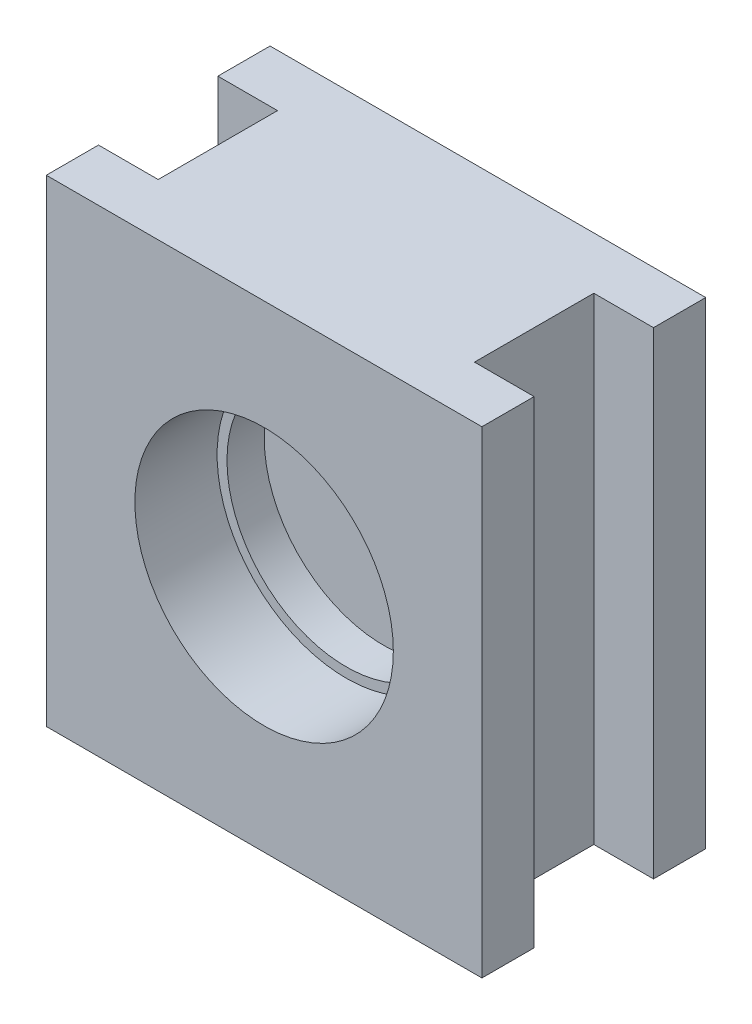
ISO-10303-21;
HEADER;
FILE_DESCRIPTION(('STEP AP214'),'2;1');
FILE_NAME('part.step','',(''),(''),'','','');
FILE_SCHEMA(('AUTOMOTIVE_DESIGN { 1 0 10303 214 1 1 1 1 }'));
ENDSEC;
DATA;
#1=APPLICATION_CONTEXT('core data for automotive mechanical design processes');
#2=APPLICATION_PROTOCOL_DEFINITION('international standard','automotive_design',2000,#1);
#3=PRODUCT_CONTEXT('',#1,'mechanical');
#4=PRODUCT('Part','Part','',(#3));
#5=PRODUCT_RELATED_PRODUCT_CATEGORY('part','',(#4));
#6=PRODUCT_DEFINITION_FORMATION('','',#4);
#7=PRODUCT_DEFINITION_CONTEXT('part definition',#1,'design');
#8=PRODUCT_DEFINITION('design','',#6,#7);
#9=PRODUCT_DEFINITION_SHAPE('','',#8);
#10=(LENGTH_UNIT() NAMED_UNIT(*) SI_UNIT(.MILLI.,.METRE.));
#11=(NAMED_UNIT(*) PLANE_ANGLE_UNIT() SI_UNIT($,.RADIAN.));
#12=(NAMED_UNIT(*) SI_UNIT($,.STERADIAN.) SOLID_ANGLE_UNIT());
#13=UNCERTAINTY_MEASURE_WITH_UNIT(LENGTH_MEASURE(1.E-05),#10,'distance_accuracy_value','');
#14=(GEOMETRIC_REPRESENTATION_CONTEXT(3) GLOBAL_UNCERTAINTY_ASSIGNED_CONTEXT((#13)) GLOBAL_UNIT_ASSIGNED_CONTEXT((#10,
#11,#12)) REPRESENTATION_CONTEXT('',''));
#15=CARTESIAN_POINT('',(0.,0.,0.));
#16=DIRECTION('',(0.,0.,1.));
#17=DIRECTION('',(1.,0.,0.));
#18=AXIS2_PLACEMENT_3D('',#15,#16,#17);
#19=CARTESIAN_POINT('',(-13.462,20.32,19.05));
#20=DIRECTION('',(1.,0.,0.));
#21=DIRECTION('',(0.,1.,0.));
#22=AXIS2_PLACEMENT_3D('',#19,#20,#21);
#23=PLANE('',#22);
#24=DIRECTION('',(0.,1.,0.));
#25=VECTOR('',#24,1.);
#26=CARTESIAN_POINT('',(-13.462,0.,4.44499999999999));
#27=LINE('',#26,#25);
#28=CARTESIAN_POINT('',(-13.462,-20.32,4.445));
#29=VERTEX_POINT('',#28);
#30=CARTESIAN_POINT('',(-13.462,20.32,4.445));
#31=VERTEX_POINT('',#30);
#32=EDGE_CURVE('E50',#29,#31,#27,.T.);
#33=ORIENTED_EDGE('',*,*,#32,.F.);
#34=DIRECTION('',(0.,0.,-1.));
#35=VECTOR('',#34,1.);
#36=CARTESIAN_POINT('',(-13.462,-20.32,19.05));
#37=LINE('',#36,#35);
#38=CARTESIAN_POINT('',(-13.462,-20.32,14.605));
#39=VERTEX_POINT('',#38);
#40=EDGE_CURVE('E11',#39,#29,#37,.T.);
#41=ORIENTED_EDGE('',*,*,#40,.F.);
#42=DIRECTION('',(0.,1.,0.));
#43=VECTOR('',#42,1.);
#44=CARTESIAN_POINT('',(-13.462,0.,14.605));
#45=LINE('',#44,#43);
#46=CARTESIAN_POINT('',(-13.462,20.32,14.605));
#47=VERTEX_POINT('',#46);
#48=EDGE_CURVE('E140',#39,#47,#45,.T.);
#49=ORIENTED_EDGE('',*,*,#48,.T.);
#50=DIRECTION('',(0.,0.,-1.));
#51=VECTOR('',#50,1.);
#52=CARTESIAN_POINT('',(-13.462,20.32,19.05));
#53=LINE('',#52,#51);
#54=EDGE_CURVE('E54',#47,#31,#53,.T.);
#55=ORIENTED_EDGE('',*,*,#54,.T.);
#56=EDGE_LOOP('',(#33,#41,#49,#55));
#57=FACE_BOUND('',#56,.T.);
#58=ADVANCED_FACE('F34',(#57),#23,.F.);
#59=CARTESIAN_POINT('',(13.462,20.32,19.05));
#60=DIRECTION('',(-1.,0.,0.));
#61=DIRECTION('',(0.,-1.,0.));
#62=AXIS2_PLACEMENT_3D('',#59,#60,#61);
#63=PLANE('',#62);
#64=DIRECTION('',(0.,0.,-1.));
#65=VECTOR('',#64,1.);
#66=CARTESIAN_POINT('',(13.462,-20.32,19.05));
#67=LINE('',#66,#65);
#68=CARTESIAN_POINT('',(13.462,-20.32,14.605));
#69=VERTEX_POINT('',#68);
#70=CARTESIAN_POINT('',(13.462,-20.32,4.445));
#71=VERTEX_POINT('',#70);
#72=EDGE_CURVE('E42',#69,#71,#67,.T.);
#73=ORIENTED_EDGE('',*,*,#72,.T.);
#74=DIRECTION('',(0.,1.,0.));
#75=VECTOR('',#74,1.);
#76=CARTESIAN_POINT('',(13.462,0.,4.44499999999999));
#77=LINE('',#76,#75);
#78=CARTESIAN_POINT('',(13.462,20.32,4.445));
#79=VERTEX_POINT('',#78);
#80=EDGE_CURVE('E178',#71,#79,#77,.T.);
#81=ORIENTED_EDGE('',*,*,#80,.T.);
#82=DIRECTION('',(0.,0.,-1.));
#83=VECTOR('',#82,1.);
#84=CARTESIAN_POINT('',(13.462,20.32,19.05));
#85=LINE('',#84,#83);
#86=CARTESIAN_POINT('',(13.462,20.32,14.605));
#87=VERTEX_POINT('',#86);
#88=EDGE_CURVE('E277',#87,#79,#85,.T.);
#89=ORIENTED_EDGE('',*,*,#88,.F.);
#90=DIRECTION('',(0.,1.,0.));
#91=VECTOR('',#90,1.);
#92=CARTESIAN_POINT('',(13.462,0.,14.605));
#93=LINE('',#92,#91);
#94=EDGE_CURVE('E301',#69,#87,#93,.T.);
#95=ORIENTED_EDGE('',*,*,#94,.F.);
#96=EDGE_LOOP('',(#73,#81,#89,#95));
#97=FACE_BOUND('',#96,.T.);
#98=ADVANCED_FACE('F188',(#97),#63,.F.);
#99=CARTESIAN_POINT('',(13.462,-20.32,19.05));
#100=DIRECTION('',(0.,1.,0.));
#101=DIRECTION('',(0.,0.,1.));
#102=AXIS2_PLACEMENT_3D('',#99,#100,#101);
#103=PLANE('',#102);
#104=DIRECTION('',(1.,0.,0.));
#105=VECTOR('',#104,1.);
#106=CARTESIAN_POINT('',(13.462,-20.32,0.));
#107=LINE('',#106,#105);
#108=CARTESIAN_POINT('',(-18.542,-20.32,0.));
#109=VERTEX_POINT('',#108);
#110=CARTESIAN_POINT('',(18.542,-20.32,0.));
#111=VERTEX_POINT('',#110);
#112=EDGE_CURVE('E294',#109,#111,#107,.T.);
#113=ORIENTED_EDGE('',*,*,#112,.T.);
#114=DIRECTION('',(0.,0.,-1.));
#115=VECTOR('',#114,1.);
#116=CARTESIAN_POINT('',(18.542,-20.32,0.));
#117=LINE('',#116,#115);
#118=CARTESIAN_POINT('',(18.542,-20.32,4.44499999999999));
#119=VERTEX_POINT('',#118);
#120=EDGE_CURVE('E324',#119,#111,#117,.T.);
#121=ORIENTED_EDGE('',*,*,#120,.F.);
#122=DIRECTION('',(-1.,0.,0.));
#123=VECTOR('',#122,1.);
#124=CARTESIAN_POINT('',(18.542,-20.32,4.44499999999999));
#125=LINE('',#124,#123);
#126=EDGE_CURVE('E305',#119,#71,#125,.T.);
#127=ORIENTED_EDGE('',*,*,#126,.T.);
#128=ORIENTED_EDGE('',*,*,#72,.F.);
#129=DIRECTION('',(-1.,0.,0.));
#130=VECTOR('',#129,1.);
#131=CARTESIAN_POINT('',(18.542,-20.32,14.605));
#132=LINE('',#131,#130);
#133=CARTESIAN_POINT('',(18.542,-20.32,14.605));
#134=VERTEX_POINT('',#133);
#135=EDGE_CURVE('E295',#134,#69,#132,.T.);
#136=ORIENTED_EDGE('',*,*,#135,.F.);
#137=DIRECTION('',(0.,0.,-1.));
#138=VECTOR('',#137,1.);
#139=CARTESIAN_POINT('',(18.542,-20.32,0.));
#140=LINE('',#139,#138);
#141=CARTESIAN_POINT('',(18.542,-20.32,19.05));
#142=VERTEX_POINT('',#141);
#143=EDGE_CURVE('E304',#142,#134,#140,.T.);
#144=ORIENTED_EDGE('',*,*,#143,.F.);
#145=DIRECTION('',(1.,0.,0.));
#146=VECTOR('',#145,1.);
#147=CARTESIAN_POINT('',(13.462,-20.32,19.05));
#148=LINE('',#147,#146);
#149=CARTESIAN_POINT('',(-18.542,-20.32,19.05));
#150=VERTEX_POINT('',#149);
#151=EDGE_CURVE('E274',#150,#142,#148,.T.);
#152=ORIENTED_EDGE('',*,*,#151,.F.);
#153=DIRECTION('',(0.,0.,-1.));
#154=VECTOR('',#153,1.);
#155=CARTESIAN_POINT('',(-18.542,-20.32,0.));
#156=LINE('',#155,#154);
#157=CARTESIAN_POINT('',(-18.542,-20.32,14.605));
#158=VERTEX_POINT('',#157);
#159=EDGE_CURVE('E155',#150,#158,#156,.T.);
#160=ORIENTED_EDGE('',*,*,#159,.T.);
#161=DIRECTION('',(1.,0.,0.));
#162=VECTOR('',#161,1.);
#163=CARTESIAN_POINT('',(-18.542,-20.32,14.605));
#164=LINE('',#163,#162);
#165=EDGE_CURVE('E167',#158,#39,#164,.T.);
#166=ORIENTED_EDGE('',*,*,#165,.T.);
#167=ORIENTED_EDGE('',*,*,#40,.T.);
#168=DIRECTION('',(1.,0.,0.));
#169=VECTOR('',#168,1.);
#170=CARTESIAN_POINT('',(-18.542,-20.32,4.44499999999999));
#171=LINE('',#170,#169);
#172=CARTESIAN_POINT('',(-18.542,-20.32,4.44499999999999));
#173=VERTEX_POINT('',#172);
#174=EDGE_CURVE('E141',#173,#29,#171,.T.);
#175=ORIENTED_EDGE('',*,*,#174,.F.);
#176=DIRECTION('',(0.,0.,-1.));
#177=VECTOR('',#176,1.);
#178=CARTESIAN_POINT('',(-18.542,-20.32,0.));
#179=LINE('',#178,#177);
#180=EDGE_CURVE('E133',#173,#109,#179,.T.);
#181=ORIENTED_EDGE('',*,*,#180,.T.);
#182=EDGE_LOOP('',(#113,#121,#127,#128,#136,#144,#152,#160,#166,#167,#175,#181));
#183=FACE_BOUND('',#182,.T.);
#184=ADVANCED_FACE('F182',(#183),#103,.F.);
#185=CARTESIAN_POINT('',(13.462,20.32,19.05));
#186=DIRECTION('',(0.,-1.,0.));
#187=DIRECTION('',(0.,0.,-1.));
#188=AXIS2_PLACEMENT_3D('',#185,#186,#187);
#189=PLANE('',#188);
#190=DIRECTION('',(-1.,0.,0.));
#191=VECTOR('',#190,1.);
#192=CARTESIAN_POINT('',(13.462,20.32,0.));
#193=LINE('',#192,#191);
#194=CARTESIAN_POINT('',(18.542,20.32,0.));
#195=VERTEX_POINT('',#194);
#196=CARTESIAN_POINT('',(-18.542,20.32,0.));
#197=VERTEX_POINT('',#196);
#198=EDGE_CURVE('E145',#195,#197,#193,.T.);
#199=ORIENTED_EDGE('',*,*,#198,.T.);
#200=DIRECTION('',(0.,0.,1.));
#201=VECTOR('',#200,1.);
#202=CARTESIAN_POINT('',(-18.542,20.32,0.));
#203=LINE('',#202,#201);
#204=CARTESIAN_POINT('',(-18.542,20.32,4.44499999999999));
#205=VERTEX_POINT('',#204);
#206=EDGE_CURVE('E130',#197,#205,#203,.T.);
#207=ORIENTED_EDGE('',*,*,#206,.T.);
#208=DIRECTION('',(1.,0.,0.));
#209=VECTOR('',#208,1.);
#210=CARTESIAN_POINT('',(-18.542,20.32,4.44499999999999));
#211=LINE('',#210,#209);
#212=EDGE_CURVE('E137',#205,#31,#211,.T.);
#213=ORIENTED_EDGE('',*,*,#212,.T.);
#214=ORIENTED_EDGE('',*,*,#54,.F.);
#215=DIRECTION('',(1.,0.,0.));
#216=VECTOR('',#215,1.);
#217=CARTESIAN_POINT('',(-18.542,20.32,14.605));
#218=LINE('',#217,#216);
#219=CARTESIAN_POINT('',(-18.542,20.32,14.605));
#220=VERTEX_POINT('',#219);
#221=EDGE_CURVE('E176',#220,#47,#218,.T.);
#222=ORIENTED_EDGE('',*,*,#221,.F.);
#223=DIRECTION('',(0.,0.,1.));
#224=VECTOR('',#223,1.);
#225=CARTESIAN_POINT('',(-18.542,20.32,0.));
#226=LINE('',#225,#224);
#227=CARTESIAN_POINT('',(-18.542,20.32,19.05));
#228=VERTEX_POINT('',#227);
#229=EDGE_CURVE('E161',#220,#228,#226,.T.);
#230=ORIENTED_EDGE('',*,*,#229,.T.);
#231=DIRECTION('',(-1.,0.,0.));
#232=VECTOR('',#231,1.);
#233=CARTESIAN_POINT('',(13.462,20.32,19.05));
#234=LINE('',#233,#232);
#235=CARTESIAN_POINT('',(18.542,20.32,19.05));
#236=VERTEX_POINT('',#235);
#237=EDGE_CURVE('E268',#236,#228,#234,.T.);
#238=ORIENTED_EDGE('',*,*,#237,.F.);
#239=DIRECTION('',(0.,0.,1.));
#240=VECTOR('',#239,1.);
#241=CARTESIAN_POINT('',(18.542,20.32,0.));
#242=LINE('',#241,#240);
#243=CARTESIAN_POINT('',(18.542,20.32,14.605));
#244=VERTEX_POINT('',#243);
#245=EDGE_CURVE('E333',#244,#236,#242,.T.);
#246=ORIENTED_EDGE('',*,*,#245,.F.);
#247=DIRECTION('',(-1.,0.,0.));
#248=VECTOR('',#247,1.);
#249=CARTESIAN_POINT('',(18.542,20.32,14.605));
#250=LINE('',#249,#248);
#251=EDGE_CURVE('E306',#244,#87,#250,.T.);
#252=ORIENTED_EDGE('',*,*,#251,.T.);
#253=ORIENTED_EDGE('',*,*,#88,.T.);
#254=DIRECTION('',(-1.,0.,0.));
#255=VECTOR('',#254,1.);
#256=CARTESIAN_POINT('',(18.542,20.32,4.44499999999999));
#257=LINE('',#256,#255);
#258=CARTESIAN_POINT('',(18.542,20.32,4.44499999999999));
#259=VERTEX_POINT('',#258);
#260=EDGE_CURVE('E329',#259,#79,#257,.T.);
#261=ORIENTED_EDGE('',*,*,#260,.F.);
#262=DIRECTION('',(0.,0.,1.));
#263=VECTOR('',#262,1.);
#264=CARTESIAN_POINT('',(18.542,20.32,0.));
#265=LINE('',#264,#263);
#266=EDGE_CURVE('E327',#195,#259,#265,.T.);
#267=ORIENTED_EDGE('',*,*,#266,.F.);
#268=EDGE_LOOP('',(#199,#207,#213,#214,#222,#230,#238,#246,#252,#253,#261,#267));
#269=FACE_BOUND('',#268,.T.);
#270=ADVANCED_FACE('F143',(#269),#189,.F.);
#271=CARTESIAN_POINT('',(0.,0.,19.05));
#272=DIRECTION('',(0.,0.,-1.));
#273=DIRECTION('',(-1.,0.,0.));
#274=AXIS2_PLACEMENT_3D('',#271,#272,#273);
#275=PLANE('',#274);
#276=CARTESIAN_POINT('',(0.,0.,19.05));
#277=DIRECTION('',(0.,0.,1.));
#278=DIRECTION('',(1.,0.,0.));
#279=AXIS2_PLACEMENT_3D('',#276,#277,#278);
#280=CIRCLE('',#279,11.);
#281=CARTESIAN_POINT('',(11.,0.,19.05));
#282=VERTEX_POINT('',#281);
#283=EDGE_CURVE('E254',#282,#282,#280,.T.);
#284=ORIENTED_EDGE('',*,*,#283,.F.);
#285=EDGE_LOOP('',(#284));
#286=FACE_BOUND('',#285,.T.);
#287=ORIENTED_EDGE('',*,*,#237,.T.);
#288=DIRECTION('',(0.,-1.,0.));
#289=VECTOR('',#288,1.);
#290=CARTESIAN_POINT('',(-18.542,0.,19.05));
#291=LINE('',#290,#289);
#292=EDGE_CURVE('E158',#228,#150,#291,.T.);
#293=ORIENTED_EDGE('',*,*,#292,.T.);
#294=ORIENTED_EDGE('',*,*,#151,.T.);
#295=DIRECTION('',(0.,-1.,0.));
#296=VECTOR('',#295,1.);
#297=CARTESIAN_POINT('',(18.542,0.,19.05));
#298=LINE('',#297,#296);
#299=EDGE_CURVE('E271',#236,#142,#298,.T.);
#300=ORIENTED_EDGE('',*,*,#299,.F.);
#301=EDGE_LOOP('',(#287,#293,#294,#300));
#302=FACE_BOUND('',#301,.T.);
#303=ADVANCED_FACE('F200',(#286,#302),#275,.F.);
#304=CARTESIAN_POINT('',(0.,0.,0.));
#305=DIRECTION('',(0.,0.,-1.));
#306=DIRECTION('',(-1.,0.,0.));
#307=AXIS2_PLACEMENT_3D('',#304,#305,#306);
#308=PLANE('',#307);
#309=ORIENTED_EDGE('',*,*,#112,.F.);
#310=DIRECTION('',(0.,1.,0.));
#311=VECTOR('',#310,1.);
#312=CARTESIAN_POINT('',(-18.542,0.,0.));
#313=LINE('',#312,#311);
#314=EDGE_CURVE('E146',#109,#197,#313,.T.);
#315=ORIENTED_EDGE('',*,*,#314,.T.);
#316=ORIENTED_EDGE('',*,*,#198,.F.);
#317=DIRECTION('',(0.,1.,0.));
#318=VECTOR('',#317,1.);
#319=CARTESIAN_POINT('',(18.542,0.,0.));
#320=LINE('',#319,#318);
#321=EDGE_CURVE('E334',#111,#195,#320,.T.);
#322=ORIENTED_EDGE('',*,*,#321,.F.);
#323=EDGE_LOOP('',(#309,#315,#316,#322));
#324=FACE_BOUND('',#323,.T.);
#325=ADVANCED_FACE('F201',(#324),#308,.T.);
#326=CARTESIAN_POINT('',(18.542,0.,14.605));
#327=DIRECTION('',(0.,0.,1.));
#328=DIRECTION('',(0.,-1.,0.));
#329=AXIS2_PLACEMENT_3D('',#326,#327,#328);
#330=PLANE('',#329);
#331=ORIENTED_EDGE('',*,*,#94,.T.);
#332=ORIENTED_EDGE('',*,*,#251,.F.);
#333=DIRECTION('',(0.,1.,0.));
#334=VECTOR('',#333,1.);
#335=CARTESIAN_POINT('',(18.542,0.,14.605));
#336=LINE('',#335,#334);
#337=EDGE_CURVE('E315',#134,#244,#336,.T.);
#338=ORIENTED_EDGE('',*,*,#337,.F.);
#339=ORIENTED_EDGE('',*,*,#135,.T.);
#340=EDGE_LOOP('',(#331,#332,#338,#339));
#341=FACE_BOUND('',#340,.T.);
#342=ADVANCED_FACE('F204',(#341),#330,.F.);
#343=CARTESIAN_POINT('',(18.542,0.,0.));
#344=DIRECTION('',(1.,0.,0.));
#345=DIRECTION('',(0.,1.,0.));
#346=AXIS2_PLACEMENT_3D('',#343,#344,#345);
#347=PLANE('',#346);
#348=ORIENTED_EDGE('',*,*,#143,.T.);
#349=ORIENTED_EDGE('',*,*,#337,.T.);
#350=ORIENTED_EDGE('',*,*,#245,.T.);
#351=ORIENTED_EDGE('',*,*,#299,.T.);
#352=EDGE_LOOP('',(#348,#349,#350,#351));
#353=FACE_BOUND('',#352,.T.);
#354=ADVANCED_FACE('F211',(#353),#347,.T.);
#355=CARTESIAN_POINT('',(18.542,0.,4.44499999999999));
#356=DIRECTION('',(0.,0.,1.));
#357=DIRECTION('',(1.,0.,0.));
#358=AXIS2_PLACEMENT_3D('',#355,#356,#357);
#359=PLANE('',#358);
#360=ORIENTED_EDGE('',*,*,#80,.F.);
#361=ORIENTED_EDGE('',*,*,#126,.F.);
#362=DIRECTION('',(0.,1.,0.));
#363=VECTOR('',#362,1.);
#364=CARTESIAN_POINT('',(18.542,0.,4.44499999999999));
#365=LINE('',#364,#363);
#366=EDGE_CURVE('E170',#119,#259,#365,.T.);
#367=ORIENTED_EDGE('',*,*,#366,.T.);
#368=ORIENTED_EDGE('',*,*,#260,.T.);
#369=EDGE_LOOP('',(#360,#361,#367,#368));
#370=FACE_BOUND('',#369,.T.);
#371=ADVANCED_FACE('F215',(#370),#359,.T.);
#372=CARTESIAN_POINT('',(18.542,0.,0.));
#373=DIRECTION('',(1.,0.,0.));
#374=DIRECTION('',(0.,1.,0.));
#375=AXIS2_PLACEMENT_3D('',#372,#373,#374);
#376=PLANE('',#375);
#377=ORIENTED_EDGE('',*,*,#366,.F.);
#378=ORIENTED_EDGE('',*,*,#120,.T.);
#379=ORIENTED_EDGE('',*,*,#321,.T.);
#380=ORIENTED_EDGE('',*,*,#266,.T.);
#381=EDGE_LOOP('',(#377,#378,#379,#380));
#382=FACE_BOUND('',#381,.T.);
#383=ADVANCED_FACE('F219',(#382),#376,.T.);
#384=CARTESIAN_POINT('',(-18.542,0.,14.605));
#385=DIRECTION('',(0.,0.,-1.));
#386=DIRECTION('',(0.,1.,0.));
#387=AXIS2_PLACEMENT_3D('',#384,#385,#386);
#388=PLANE('',#387);
#389=ORIENTED_EDGE('',*,*,#48,.F.);
#390=ORIENTED_EDGE('',*,*,#165,.F.);
#391=DIRECTION('',(0.,1.,0.));
#392=VECTOR('',#391,1.);
#393=CARTESIAN_POINT('',(-18.542,0.,14.605));
#394=LINE('',#393,#392);
#395=EDGE_CURVE('E164',#158,#220,#394,.T.);
#396=ORIENTED_EDGE('',*,*,#395,.T.);
#397=ORIENTED_EDGE('',*,*,#221,.T.);
#398=EDGE_LOOP('',(#389,#390,#396,#397));
#399=FACE_BOUND('',#398,.T.);
#400=ADVANCED_FACE('F186',(#399),#388,.T.);
#401=CARTESIAN_POINT('',(-18.542,0.,0.));
#402=DIRECTION('',(-1.,0.,0.));
#403=DIRECTION('',(0.,1.,0.));
#404=AXIS2_PLACEMENT_3D('',#401,#402,#403);
#405=PLANE('',#404);
#406=ORIENTED_EDGE('',*,*,#159,.F.);
#407=ORIENTED_EDGE('',*,*,#292,.F.);
#408=ORIENTED_EDGE('',*,*,#229,.F.);
#409=ORIENTED_EDGE('',*,*,#395,.F.);
#410=EDGE_LOOP('',(#406,#407,#408,#409));
#411=FACE_BOUND('',#410,.T.);
#412=ADVANCED_FACE('F226',(#411),#405,.T.);
#413=CARTESIAN_POINT('',(-18.542,0.,4.44499999999999));
#414=DIRECTION('',(0.,0.,-1.));
#415=DIRECTION('',(-1.,0.,0.));
#416=AXIS2_PLACEMENT_3D('',#413,#414,#415);
#417=PLANE('',#416);
#418=ORIENTED_EDGE('',*,*,#32,.T.);
#419=ORIENTED_EDGE('',*,*,#212,.F.);
#420=DIRECTION('',(0.,1.,0.));
#421=VECTOR('',#420,1.);
#422=CARTESIAN_POINT('',(-18.542,0.,4.44499999999999));
#423=LINE('',#422,#421);
#424=EDGE_CURVE('E125',#173,#205,#423,.T.);
#425=ORIENTED_EDGE('',*,*,#424,.F.);
#426=ORIENTED_EDGE('',*,*,#174,.T.);
#427=EDGE_LOOP('',(#418,#419,#425,#426));
#428=FACE_BOUND('',#427,.T.);
#429=ADVANCED_FACE('F138',(#428),#417,.F.);
#430=CARTESIAN_POINT('',(-18.542,0.,0.));
#431=DIRECTION('',(-1.,0.,0.));
#432=DIRECTION('',(0.,1.,0.));
#433=AXIS2_PLACEMENT_3D('',#430,#431,#432);
#434=PLANE('',#433);
#435=ORIENTED_EDGE('',*,*,#424,.T.);
#436=ORIENTED_EDGE('',*,*,#206,.F.);
#437=ORIENTED_EDGE('',*,*,#314,.F.);
#438=ORIENTED_EDGE('',*,*,#180,.F.);
#439=EDGE_LOOP('',(#435,#436,#437,#438));
#440=FACE_BOUND('',#439,.T.);
#441=ADVANCED_FACE('F127',(#440),#434,.T.);
#442=CARTESIAN_POINT('',(0.,0.,12.05));
#443=DIRECTION('',(0.,0.,1.));
#444=DIRECTION('',(1.,0.,0.));
#445=AXIS2_PLACEMENT_3D('',#442,#443,#444);
#446=CYLINDRICAL_SURFACE('',#445,11.);
#447=CARTESIAN_POINT('',(0.,0.,12.05));
#448=DIRECTION('',(0.,0.,1.));
#449=DIRECTION('',(1.,0.,0.));
#450=AXIS2_PLACEMENT_3D('',#447,#448,#449);
#451=CIRCLE('',#450,11.);
#452=CARTESIAN_POINT('',(11.,0.,12.05));
#453=VERTEX_POINT('',#452);
#454=EDGE_CURVE('E153',#453,#453,#451,.T.);
#455=ORIENTED_EDGE('',*,*,#454,.F.);
#456=EDGE_LOOP('',(#455));
#457=FACE_BOUND('',#456,.T.);
#458=ORIENTED_EDGE('',*,*,#283,.T.);
#459=EDGE_LOOP('',(#458));
#460=FACE_BOUND('',#459,.T.);
#461=ADVANCED_FACE('F234',(#457,#460),#446,.F.);
#462=CARTESIAN_POINT('',(0.,0.,12.05));
#463=DIRECTION('',(0.,0.,1.));
#464=DIRECTION('',(1.,0.,0.));
#465=AXIS2_PLACEMENT_3D('',#462,#463,#464);
#466=PLANE('',#465);
#467=CARTESIAN_POINT('',(0.,0.,12.05));
#468=DIRECTION('',(0.,0.,1.));
#469=DIRECTION('',(1.,0.,0.));
#470=AXIS2_PLACEMENT_3D('',#467,#468,#469);
#471=CIRCLE('',#470,10.16);
#472=CARTESIAN_POINT('',(10.16,0.,12.05));
#473=VERTEX_POINT('',#472);
#474=EDGE_CURVE('E255',#473,#473,#471,.T.);
#475=ORIENTED_EDGE('',*,*,#474,.F.);
#476=EDGE_LOOP('',(#475));
#477=FACE_BOUND('',#476,.T.);
#478=ORIENTED_EDGE('',*,*,#454,.T.);
#479=EDGE_LOOP('',(#478));
#480=FACE_BOUND('',#479,.T.);
#481=ADVANCED_FACE('F237',(#477,#480),#466,.T.);
#482=CARTESIAN_POINT('',(0.,0.,8.875));
#483=DIRECTION('',(0.,0.,1.));
#484=DIRECTION('',(1.,0.,0.));
#485=AXIS2_PLACEMENT_3D('',#482,#483,#484);
#486=CYLINDRICAL_SURFACE('',#485,10.16);
#487=CARTESIAN_POINT('',(0.,0.,8.875));
#488=DIRECTION('',(0.,0.,1.));
#489=DIRECTION('',(1.,0.,0.));
#490=AXIS2_PLACEMENT_3D('',#487,#488,#489);
#491=CIRCLE('',#490,10.16);
#492=CARTESIAN_POINT('',(10.16,0.,8.875));
#493=VERTEX_POINT('',#492);
#494=EDGE_CURVE('E253',#493,#493,#491,.T.);
#495=ORIENTED_EDGE('',*,*,#494,.F.);
#496=EDGE_LOOP('',(#495));
#497=FACE_BOUND('',#496,.T.);
#498=ORIENTED_EDGE('',*,*,#474,.T.);
#499=EDGE_LOOP('',(#498));
#500=FACE_BOUND('',#499,.T.);
#501=ADVANCED_FACE('F241',(#497,#500),#486,.F.);
#502=CARTESIAN_POINT('',(0.,0.,8.875));
#503=DIRECTION('',(0.,0.,1.));
#504=DIRECTION('',(1.,0.,0.));
#505=AXIS2_PLACEMENT_3D('',#502,#503,#504);
#506=PLANE('',#505);
#507=ORIENTED_EDGE('',*,*,#494,.T.);
#508=EDGE_LOOP('',(#507));
#509=FACE_BOUND('',#508,.T.);
#510=ADVANCED_FACE('F245',(#509),#506,.T.);
#511=CLOSED_SHELL('',(#58,#98,#184,#270,#303,#325,#342,#354,#371,#383,#400,#412,#429,#441,#461,
#481,#501,#510));
#512=MANIFOLD_SOLID_BREP('B2',#511);
#513=ADVANCED_BREP_SHAPE_REPRESENTATION('',(#18,#512),#14);
#514=SHAPE_DEFINITION_REPRESENTATION(#9,#513);
ENDSEC;
END-ISO-10303-21;
